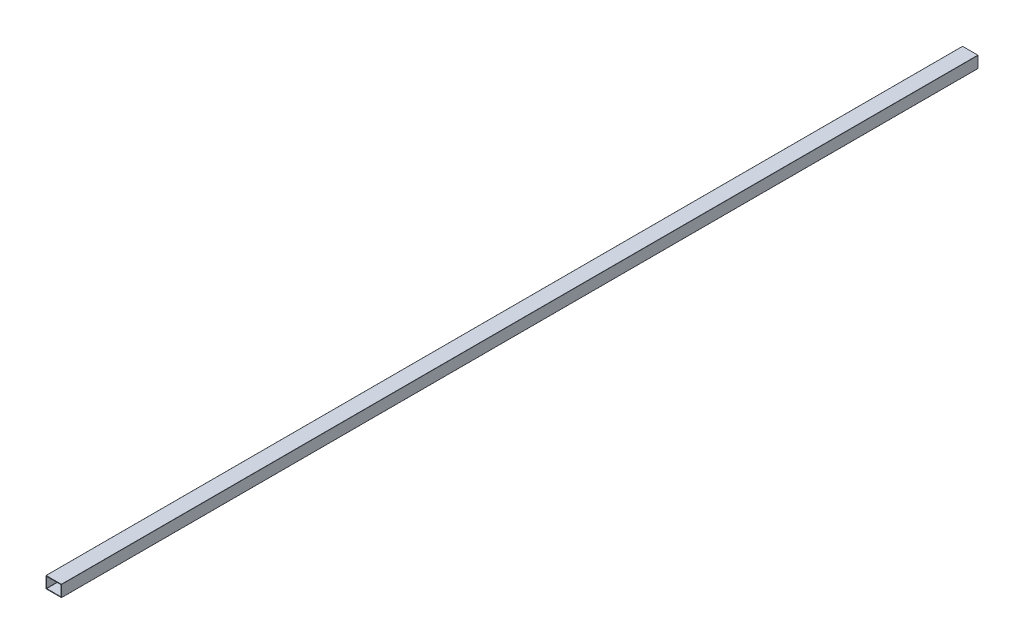
ISO-10303-21;
HEADER;
FILE_DESCRIPTION(('STEP AP214'),'2;1');
FILE_NAME('part.step','',(''),(''),'','','');
FILE_SCHEMA(('AUTOMOTIVE_DESIGN { 1 0 10303 214 1 1 1 1 }'));
ENDSEC;
DATA;
#1=APPLICATION_CONTEXT('core data for automotive mechanical design processes');
#2=APPLICATION_PROTOCOL_DEFINITION('international standard','automotive_design',2000,#1);
#3=PRODUCT_CONTEXT('',#1,'mechanical');
#4=PRODUCT('Part','Part','',(#3));
#5=PRODUCT_RELATED_PRODUCT_CATEGORY('part','',(#4));
#6=PRODUCT_DEFINITION_FORMATION('','',#4);
#7=PRODUCT_DEFINITION_CONTEXT('part definition',#1,'design');
#8=PRODUCT_DEFINITION('design','',#6,#7);
#9=PRODUCT_DEFINITION_SHAPE('','',#8);
#10=(LENGTH_UNIT() NAMED_UNIT(*) SI_UNIT(.MILLI.,.METRE.));
#11=(NAMED_UNIT(*) PLANE_ANGLE_UNIT() SI_UNIT($,.RADIAN.));
#12=(NAMED_UNIT(*) SI_UNIT($,.STERADIAN.) SOLID_ANGLE_UNIT());
#13=UNCERTAINTY_MEASURE_WITH_UNIT(LENGTH_MEASURE(1.E-05),#10,'distance_accuracy_value','');
#14=(GEOMETRIC_REPRESENTATION_CONTEXT(3) GLOBAL_UNCERTAINTY_ASSIGNED_CONTEXT((#13)) GLOBAL_UNIT_ASSIGNED_CONTEXT((#10,
#11,#12)) REPRESENTATION_CONTEXT('',''));
#15=CARTESIAN_POINT('',(0.,0.,0.));
#16=DIRECTION('',(0.,0.,1.));
#17=DIRECTION('',(1.,0.,0.));
#18=AXIS2_PLACEMENT_3D('',#15,#16,#17);
#19=CARTESIAN_POINT('',(50.8,-38.1,-6000.));
#20=DIRECTION('',(1.,0.,0.));
#21=DIRECTION('',(0.,0.,-1.));
#22=AXIS2_PLACEMENT_3D('',#19,#20,#21);
#23=PLANE('',#22);
#24=DIRECTION('',(0.,1.,0.));
#25=VECTOR('',#24,1.);
#26=CARTESIAN_POINT('',(50.8,-38.1,0.));
#27=LINE('',#26,#25);
#28=CARTESIAN_POINT('',(50.8,-37.1,0.));
#29=VERTEX_POINT('',#28);
#30=CARTESIAN_POINT('',(50.8,37.1,0.));
#31=VERTEX_POINT('',#30);
#32=EDGE_CURVE('E197',#29,#31,#27,.T.);
#33=ORIENTED_EDGE('',*,*,#32,.F.);
#34=DIRECTION('',(0.,0.,1.));
#35=VECTOR('',#34,1.);
#36=CARTESIAN_POINT('',(50.8,-37.1,-6000.));
#37=LINE('',#36,#35);
#38=CARTESIAN_POINT('',(50.8,-37.1,-6000.));
#39=VERTEX_POINT('',#38);
#40=EDGE_CURVE('E158',#29,#39,#37,.F.);
#41=ORIENTED_EDGE('',*,*,#40,.T.);
#42=DIRECTION('',(0.,1.,0.));
#43=VECTOR('',#42,1.);
#44=CARTESIAN_POINT('',(50.8,-38.1,-6000.));
#45=LINE('',#44,#43);
#46=CARTESIAN_POINT('',(50.8,37.1,-6000.));
#47=VERTEX_POINT('',#46);
#48=EDGE_CURVE('E185',#39,#47,#45,.T.);
#49=ORIENTED_EDGE('',*,*,#48,.T.);
#50=DIRECTION('',(0.,0.,1.));
#51=VECTOR('',#50,1.);
#52=CARTESIAN_POINT('',(50.8,37.1,-6000.));
#53=LINE('',#52,#51);
#54=EDGE_CURVE('E251',#47,#31,#53,.T.);
#55=ORIENTED_EDGE('',*,*,#54,.T.);
#56=EDGE_LOOP('',(#33,#41,#49,#55));
#57=FACE_BOUND('',#56,.T.);
#58=ADVANCED_FACE('F33',(#57),#23,.T.);
#59=CARTESIAN_POINT('',(-50.8,-38.1,-6000.));
#60=DIRECTION('',(0.,-1.,0.));
#61=DIRECTION('',(0.,0.,-1.));
#62=AXIS2_PLACEMENT_3D('',#59,#60,#61);
#63=PLANE('',#62);
#64=DIRECTION('',(1.,0.,0.));
#65=VECTOR('',#64,1.);
#66=CARTESIAN_POINT('',(-50.8,-38.1,0.));
#67=LINE('',#66,#65);
#68=CARTESIAN_POINT('',(-49.8,-38.1,0.));
#69=VERTEX_POINT('',#68);
#70=CARTESIAN_POINT('',(49.8,-38.1,0.));
#71=VERTEX_POINT('',#70);
#72=EDGE_CURVE('E189',#69,#71,#67,.T.);
#73=ORIENTED_EDGE('',*,*,#72,.F.);
#74=DIRECTION('',(0.,0.,1.));
#75=VECTOR('',#74,1.);
#76=CARTESIAN_POINT('',(-49.8,-38.1,-6000.));
#77=LINE('',#76,#75);
#78=CARTESIAN_POINT('',(-49.8,-38.1,-6000.));
#79=VERTEX_POINT('',#78);
#80=EDGE_CURVE('E238',#69,#79,#77,.F.);
#81=ORIENTED_EDGE('',*,*,#80,.T.);
#82=DIRECTION('',(1.,0.,0.));
#83=VECTOR('',#82,1.);
#84=CARTESIAN_POINT('',(-50.8,-38.1,-6000.));
#85=LINE('',#84,#83);
#86=CARTESIAN_POINT('',(49.8,-38.1,-6000.));
#87=VERTEX_POINT('',#86);
#88=EDGE_CURVE('E194',#79,#87,#85,.T.);
#89=ORIENTED_EDGE('',*,*,#88,.T.);
#90=DIRECTION('',(0.,0.,1.));
#91=VECTOR('',#90,1.);
#92=CARTESIAN_POINT('',(49.8,-38.1,-6000.));
#93=LINE('',#92,#91);
#94=EDGE_CURVE('E235',#87,#71,#93,.T.);
#95=ORIENTED_EDGE('',*,*,#94,.T.);
#96=EDGE_LOOP('',(#73,#81,#89,#95));
#97=FACE_BOUND('',#96,.T.);
#98=ADVANCED_FACE('F305',(#97),#63,.T.);
#99=CARTESIAN_POINT('',(-50.8,-38.1,-6000.));
#100=DIRECTION('',(-1.,0.,0.));
#101=DIRECTION('',(0.,0.,1.));
#102=AXIS2_PLACEMENT_3D('',#99,#100,#101);
#103=PLANE('',#102);
#104=DIRECTION('',(0.,-1.,0.));
#105=VECTOR('',#104,1.);
#106=CARTESIAN_POINT('',(-50.8,-38.1,-6000.));
#107=LINE('',#106,#105);
#108=CARTESIAN_POINT('',(-50.8,37.1,-6000.));
#109=VERTEX_POINT('',#108);
#110=CARTESIAN_POINT('',(-50.8,-37.1,-6000.));
#111=VERTEX_POINT('',#110);
#112=EDGE_CURVE('E191',#109,#111,#107,.T.);
#113=ORIENTED_EDGE('',*,*,#112,.T.);
#114=DIRECTION('',(0.,0.,1.));
#115=VECTOR('',#114,1.);
#116=CARTESIAN_POINT('',(-50.8,-37.1,-6000.));
#117=LINE('',#116,#115);
#118=CARTESIAN_POINT('',(-50.8,-37.1,0.));
#119=VERTEX_POINT('',#118);
#120=EDGE_CURVE('E224',#111,#119,#117,.T.);
#121=ORIENTED_EDGE('',*,*,#120,.T.);
#122=DIRECTION('',(0.,-1.,0.));
#123=VECTOR('',#122,1.);
#124=CARTESIAN_POINT('',(-50.8,-38.1,0.));
#125=LINE('',#124,#123);
#126=CARTESIAN_POINT('',(-50.8,37.1,0.));
#127=VERTEX_POINT('',#126);
#128=EDGE_CURVE('E203',#127,#119,#125,.T.);
#129=ORIENTED_EDGE('',*,*,#128,.F.);
#130=DIRECTION('',(0.,0.,1.));
#131=VECTOR('',#130,1.);
#132=CARTESIAN_POINT('',(-50.8,37.1,-6000.));
#133=LINE('',#132,#131);
#134=EDGE_CURVE('E222',#127,#109,#133,.F.);
#135=ORIENTED_EDGE('',*,*,#134,.T.);
#136=EDGE_LOOP('',(#113,#121,#129,#135));
#137=FACE_BOUND('',#136,.T.);
#138=ADVANCED_FACE('F311',(#137),#103,.T.);
#139=CARTESIAN_POINT('',(-50.8,38.1,-6000.));
#140=DIRECTION('',(0.,1.,0.));
#141=DIRECTION('',(0.,0.,1.));
#142=AXIS2_PLACEMENT_3D('',#139,#140,#141);
#143=PLANE('',#142);
#144=DIRECTION('',(-1.,0.,0.));
#145=VECTOR('',#144,1.);
#146=CARTESIAN_POINT('',(-50.8,38.1,-6000.));
#147=LINE('',#146,#145);
#148=CARTESIAN_POINT('',(49.8,38.1,-6000.));
#149=VERTEX_POINT('',#148);
#150=CARTESIAN_POINT('',(-49.8,38.1,-6000.));
#151=VERTEX_POINT('',#150);
#152=EDGE_CURVE('E188',#149,#151,#147,.T.);
#153=ORIENTED_EDGE('',*,*,#152,.T.);
#154=DIRECTION('',(0.,0.,1.));
#155=VECTOR('',#154,1.);
#156=CARTESIAN_POINT('',(-49.8,38.1,-6000.));
#157=LINE('',#156,#155);
#158=CARTESIAN_POINT('',(-49.8,38.1,0.));
#159=VERTEX_POINT('',#158);
#160=EDGE_CURVE('E248',#151,#159,#157,.T.);
#161=ORIENTED_EDGE('',*,*,#160,.T.);
#162=DIRECTION('',(-1.,0.,0.));
#163=VECTOR('',#162,1.);
#164=CARTESIAN_POINT('',(-50.8,38.1,0.));
#165=LINE('',#164,#163);
#166=CARTESIAN_POINT('',(49.8,38.1,0.));
#167=VERTEX_POINT('',#166);
#168=EDGE_CURVE('E200',#167,#159,#165,.T.);
#169=ORIENTED_EDGE('',*,*,#168,.F.);
#170=DIRECTION('',(0.,0.,1.));
#171=VECTOR('',#170,1.);
#172=CARTESIAN_POINT('',(49.8,38.1,-6000.));
#173=LINE('',#172,#171);
#174=EDGE_CURVE('E55',#167,#149,#173,.F.);
#175=ORIENTED_EDGE('',*,*,#174,.T.);
#176=EDGE_LOOP('',(#153,#161,#169,#175));
#177=FACE_BOUND('',#176,.T.);
#178=ADVANCED_FACE('F316',(#177),#143,.T.);
#179=CARTESIAN_POINT('',(0.,0.,-6000.));
#180=DIRECTION('',(0.,0.,-1.));
#181=DIRECTION('',(-1.,0.,0.));
#182=AXIS2_PLACEMENT_3D('',#179,#180,#181);
#183=PLANE('',#182);
#184=DIRECTION('',(0.,-1.,0.));
#185=VECTOR('',#184,1.);
#186=CARTESIAN_POINT('',(-47.,-34.3,-6000.));
#187=LINE('',#186,#185);
#188=CARTESIAN_POINT('',(-47.,33.3,-6000.));
#189=VERTEX_POINT('',#188);
#190=CARTESIAN_POINT('',(-47.,-33.3,-6000.));
#191=VERTEX_POINT('',#190);
#192=EDGE_CURVE('E167',#189,#191,#187,.T.);
#193=ORIENTED_EDGE('',*,*,#192,.T.);
#194=CARTESIAN_POINT('',(-46.,-33.3,-6000.));
#195=DIRECTION('',(0.,0.,-1.));
#196=DIRECTION('',(-1.,0.,0.));
#197=AXIS2_PLACEMENT_3D('',#194,#195,#196);
#198=CIRCLE('',#197,1.);
#199=CARTESIAN_POINT('',(-46.,-34.3,-6000.));
#200=VERTEX_POINT('',#199);
#201=EDGE_CURVE('E11',#191,#200,#198,.F.);
#202=ORIENTED_EDGE('',*,*,#201,.T.);
#203=DIRECTION('',(1.,0.,0.));
#204=VECTOR('',#203,1.);
#205=CARTESIAN_POINT('',(-47.,-34.3,-6000.));
#206=LINE('',#205,#204);
#207=CARTESIAN_POINT('',(46.,-34.3,-6000.));
#208=VERTEX_POINT('',#207);
#209=EDGE_CURVE('E175',#200,#208,#206,.T.);
#210=ORIENTED_EDGE('',*,*,#209,.T.);
#211=CARTESIAN_POINT('',(46.,-33.3,-6000.));
#212=DIRECTION('',(0.,0.,-1.));
#213=DIRECTION('',(-1.,0.,0.));
#214=AXIS2_PLACEMENT_3D('',#211,#212,#213);
#215=CIRCLE('',#214,1.);
#216=CARTESIAN_POINT('',(47.,-33.3,-6000.));
#217=VERTEX_POINT('',#216);
#218=EDGE_CURVE('E262',#208,#217,#215,.F.);
#219=ORIENTED_EDGE('',*,*,#218,.T.);
#220=DIRECTION('',(0.,1.,0.));
#221=VECTOR('',#220,1.);
#222=CARTESIAN_POINT('',(47.,-34.3,-6000.));
#223=LINE('',#222,#221);
#224=CARTESIAN_POINT('',(47.,33.3,-6000.));
#225=VERTEX_POINT('',#224);
#226=EDGE_CURVE('E179',#217,#225,#223,.T.);
#227=ORIENTED_EDGE('',*,*,#226,.T.);
#228=CARTESIAN_POINT('',(46.,33.3,-6000.));
#229=DIRECTION('',(0.,0.,-1.));
#230=DIRECTION('',(-1.,0.,0.));
#231=AXIS2_PLACEMENT_3D('',#228,#229,#230);
#232=CIRCLE('',#231,1.);
#233=CARTESIAN_POINT('',(46.,34.3,-6000.));
#234=VERTEX_POINT('',#233);
#235=EDGE_CURVE('E258',#225,#234,#232,.F.);
#236=ORIENTED_EDGE('',*,*,#235,.T.);
#237=DIRECTION('',(-1.,0.,0.));
#238=VECTOR('',#237,1.);
#239=CARTESIAN_POINT('',(-47.,34.3,-6000.));
#240=LINE('',#239,#238);
#241=CARTESIAN_POINT('',(-46.,34.3,-6000.));
#242=VERTEX_POINT('',#241);
#243=EDGE_CURVE('E277',#234,#242,#240,.T.);
#244=ORIENTED_EDGE('',*,*,#243,.T.);
#245=CARTESIAN_POINT('',(-46.,33.3,-6000.));
#246=DIRECTION('',(0.,0.,-1.));
#247=DIRECTION('',(-1.,0.,0.));
#248=AXIS2_PLACEMENT_3D('',#245,#246,#247);
#249=CIRCLE('',#248,1.);
#250=EDGE_CURVE('E157',#242,#189,#249,.F.);
#251=ORIENTED_EDGE('',*,*,#250,.T.);
#252=EDGE_LOOP('',(#193,#202,#210,#219,#227,#236,#244,#251));
#253=FACE_BOUND('',#252,.T.);
#254=ORIENTED_EDGE('',*,*,#88,.F.);
#255=CARTESIAN_POINT('',(-49.8,-37.1,-6000.));
#256=DIRECTION('',(0.,0.,-1.));
#257=DIRECTION('',(-1.,0.,0.));
#258=AXIS2_PLACEMENT_3D('',#255,#256,#257);
#259=CIRCLE('',#258,1.);
#260=EDGE_CURVE('E245',#79,#111,#259,.T.);
#261=ORIENTED_EDGE('',*,*,#260,.T.);
#262=ORIENTED_EDGE('',*,*,#112,.F.);
#263=CARTESIAN_POINT('',(-49.8,37.1,-6000.));
#264=DIRECTION('',(0.,0.,-1.));
#265=DIRECTION('',(-1.,0.,0.));
#266=AXIS2_PLACEMENT_3D('',#263,#264,#265);
#267=CIRCLE('',#266,1.);
#268=EDGE_CURVE('E48',#109,#151,#267,.T.);
#269=ORIENTED_EDGE('',*,*,#268,.T.);
#270=ORIENTED_EDGE('',*,*,#152,.F.);
#271=CARTESIAN_POINT('',(49.8,37.1,-6000.));
#272=DIRECTION('',(0.,0.,-1.));
#273=DIRECTION('',(-1.,0.,0.));
#274=AXIS2_PLACEMENT_3D('',#271,#272,#273);
#275=CIRCLE('',#274,1.);
#276=EDGE_CURVE('E240',#149,#47,#275,.T.);
#277=ORIENTED_EDGE('',*,*,#276,.T.);
#278=ORIENTED_EDGE('',*,*,#48,.F.);
#279=CARTESIAN_POINT('',(49.8,-37.1,-6000.));
#280=DIRECTION('',(0.,0.,-1.));
#281=DIRECTION('',(-1.,0.,0.));
#282=AXIS2_PLACEMENT_3D('',#279,#280,#281);
#283=CIRCLE('',#282,1.);
#284=EDGE_CURVE('E242',#39,#87,#283,.T.);
#285=ORIENTED_EDGE('',*,*,#284,.T.);
#286=EDGE_LOOP('',(#254,#261,#262,#269,#270,#277,#278,#285));
#287=FACE_BOUND('',#286,.T.);
#288=ADVANCED_FACE('F267',(#253,#287),#183,.T.);
#289=CARTESIAN_POINT('',(0.,0.,0.));
#290=DIRECTION('',(0.,0.,-1.));
#291=DIRECTION('',(-1.,0.,0.));
#292=AXIS2_PLACEMENT_3D('',#289,#290,#291);
#293=PLANE('',#292);
#294=DIRECTION('',(0.,1.,0.));
#295=VECTOR('',#294,1.);
#296=CARTESIAN_POINT('',(47.,-34.3,0.));
#297=LINE('',#296,#295);
#298=CARTESIAN_POINT('',(47.,-33.3,0.));
#299=VERTEX_POINT('',#298);
#300=CARTESIAN_POINT('',(47.,33.3,0.));
#301=VERTEX_POINT('',#300);
#302=EDGE_CURVE('E181',#299,#301,#297,.T.);
#303=ORIENTED_EDGE('',*,*,#302,.F.);
#304=CARTESIAN_POINT('',(46.,-33.3,0.));
#305=DIRECTION('',(0.,0.,-1.));
#306=DIRECTION('',(-1.,0.,0.));
#307=AXIS2_PLACEMENT_3D('',#304,#305,#306);
#308=CIRCLE('',#307,1.);
#309=CARTESIAN_POINT('',(46.,-34.3,0.));
#310=VERTEX_POINT('',#309);
#311=EDGE_CURVE('E260',#299,#310,#308,.T.);
#312=ORIENTED_EDGE('',*,*,#311,.T.);
#313=DIRECTION('',(1.,0.,0.));
#314=VECTOR('',#313,1.);
#315=CARTESIAN_POINT('',(-47.,-34.3,0.));
#316=LINE('',#315,#314);
#317=CARTESIAN_POINT('',(-46.,-34.3,0.));
#318=VERTEX_POINT('',#317);
#319=EDGE_CURVE('E281',#318,#310,#316,.T.);
#320=ORIENTED_EDGE('',*,*,#319,.F.);
#321=CARTESIAN_POINT('',(-46.,-33.3,0.));
#322=DIRECTION('',(0.,0.,-1.));
#323=DIRECTION('',(-1.,0.,0.));
#324=AXIS2_PLACEMENT_3D('',#321,#322,#323);
#325=CIRCLE('',#324,1.);
#326=CARTESIAN_POINT('',(-47.,-33.3,0.));
#327=VERTEX_POINT('',#326);
#328=EDGE_CURVE('E41',#318,#327,#325,.T.);
#329=ORIENTED_EDGE('',*,*,#328,.T.);
#330=DIRECTION('',(0.,-1.,0.));
#331=VECTOR('',#330,1.);
#332=CARTESIAN_POINT('',(-47.,-34.3,0.));
#333=LINE('',#332,#331);
#334=CARTESIAN_POINT('',(-47.,33.3,0.));
#335=VERTEX_POINT('',#334);
#336=EDGE_CURVE('E164',#335,#327,#333,.T.);
#337=ORIENTED_EDGE('',*,*,#336,.F.);
#338=CARTESIAN_POINT('',(-46.,33.3,0.));
#339=DIRECTION('',(0.,0.,-1.));
#340=DIRECTION('',(-1.,0.,0.));
#341=AXIS2_PLACEMENT_3D('',#338,#339,#340);
#342=CIRCLE('',#341,1.);
#343=CARTESIAN_POINT('',(-46.,34.3,0.));
#344=VERTEX_POINT('',#343);
#345=EDGE_CURVE('E147',#335,#344,#342,.T.);
#346=ORIENTED_EDGE('',*,*,#345,.T.);
#347=DIRECTION('',(-1.,0.,0.));
#348=VECTOR('',#347,1.);
#349=CARTESIAN_POINT('',(-47.,34.3,0.));
#350=LINE('',#349,#348);
#351=CARTESIAN_POINT('',(46.,34.3,0.));
#352=VERTEX_POINT('',#351);
#353=EDGE_CURVE('E176',#352,#344,#350,.T.);
#354=ORIENTED_EDGE('',*,*,#353,.F.);
#355=CARTESIAN_POINT('',(46.,33.3,0.));
#356=DIRECTION('',(0.,0.,-1.));
#357=DIRECTION('',(-1.,0.,0.));
#358=AXIS2_PLACEMENT_3D('',#355,#356,#357);
#359=CIRCLE('',#358,1.);
#360=EDGE_CURVE('E256',#352,#301,#359,.T.);
#361=ORIENTED_EDGE('',*,*,#360,.T.);
#362=EDGE_LOOP('',(#303,#312,#320,#329,#337,#346,#354,#361));
#363=FACE_BOUND('',#362,.T.);
#364=ORIENTED_EDGE('',*,*,#128,.T.);
#365=CARTESIAN_POINT('',(-49.8,-37.1,0.));
#366=DIRECTION('',(0.,0.,-1.));
#367=DIRECTION('',(-1.,0.,0.));
#368=AXIS2_PLACEMENT_3D('',#365,#366,#367);
#369=CIRCLE('',#368,1.);
#370=EDGE_CURVE('E233',#119,#69,#369,.F.);
#371=ORIENTED_EDGE('',*,*,#370,.T.);
#372=ORIENTED_EDGE('',*,*,#72,.T.);
#373=CARTESIAN_POINT('',(49.8,-37.1,0.));
#374=DIRECTION('',(0.,0.,-1.));
#375=DIRECTION('',(-1.,0.,0.));
#376=AXIS2_PLACEMENT_3D('',#373,#374,#375);
#377=CIRCLE('',#376,1.);
#378=EDGE_CURVE('E229',#71,#29,#377,.F.);
#379=ORIENTED_EDGE('',*,*,#378,.T.);
#380=ORIENTED_EDGE('',*,*,#32,.T.);
#381=CARTESIAN_POINT('',(49.8,37.1,0.));
#382=DIRECTION('',(0.,0.,-1.));
#383=DIRECTION('',(-1.,0.,0.));
#384=AXIS2_PLACEMENT_3D('',#381,#382,#383);
#385=CIRCLE('',#384,1.);
#386=EDGE_CURVE('E227',#31,#167,#385,.F.);
#387=ORIENTED_EDGE('',*,*,#386,.T.);
#388=ORIENTED_EDGE('',*,*,#168,.T.);
#389=CARTESIAN_POINT('',(-49.8,37.1,0.));
#390=DIRECTION('',(0.,0.,-1.));
#391=DIRECTION('',(-1.,0.,0.));
#392=AXIS2_PLACEMENT_3D('',#389,#390,#391);
#393=CIRCLE('',#392,1.);
#394=EDGE_CURVE('E231',#159,#127,#393,.F.);
#395=ORIENTED_EDGE('',*,*,#394,.T.);
#396=EDGE_LOOP('',(#364,#371,#372,#379,#380,#387,#388,#395));
#397=FACE_BOUND('',#396,.T.);
#398=ADVANCED_FACE('F172',(#363,#397),#293,.F.);
#399=CARTESIAN_POINT('',(-47.,-34.3,-6000.));
#400=DIRECTION('',(0.,-1.,0.));
#401=DIRECTION('',(0.,0.,-1.));
#402=AXIS2_PLACEMENT_3D('',#399,#400,#401);
#403=PLANE('',#402);
#404=ORIENTED_EDGE('',*,*,#319,.T.);
#405=DIRECTION('',(0.,0.,1.));
#406=VECTOR('',#405,1.);
#407=CARTESIAN_POINT('',(46.,-34.3,-6000.));
#408=LINE('',#407,#406);
#409=EDGE_CURVE('E220',#310,#208,#408,.F.);
#410=ORIENTED_EDGE('',*,*,#409,.T.);
#411=ORIENTED_EDGE('',*,*,#209,.F.);
#412=DIRECTION('',(0.,0.,1.));
#413=VECTOR('',#412,1.);
#414=CARTESIAN_POINT('',(-46.,-34.3,0.));
#415=LINE('',#414,#413);
#416=EDGE_CURVE('E217',#200,#318,#415,.T.);
#417=ORIENTED_EDGE('',*,*,#416,.T.);
#418=EDGE_LOOP('',(#404,#410,#411,#417));
#419=FACE_BOUND('',#418,.T.);
#420=ADVANCED_FACE('F283',(#419),#403,.F.);
#421=CARTESIAN_POINT('',(-47.,-34.3,-6000.));
#422=DIRECTION('',(-1.,0.,0.));
#423=DIRECTION('',(0.,0.,1.));
#424=AXIS2_PLACEMENT_3D('',#421,#422,#423);
#425=PLANE('',#424);
#426=ORIENTED_EDGE('',*,*,#192,.F.);
#427=DIRECTION('',(0.,0.,1.));
#428=VECTOR('',#427,1.);
#429=CARTESIAN_POINT('',(-47.,33.3,0.));
#430=LINE('',#429,#428);
#431=EDGE_CURVE('E151',#189,#335,#430,.T.);
#432=ORIENTED_EDGE('',*,*,#431,.T.);
#433=ORIENTED_EDGE('',*,*,#336,.T.);
#434=DIRECTION('',(0.,0.,1.));
#435=VECTOR('',#434,1.);
#436=CARTESIAN_POINT('',(-47.,-33.3,-6000.));
#437=LINE('',#436,#435);
#438=EDGE_CURVE('E169',#327,#191,#437,.F.);
#439=ORIENTED_EDGE('',*,*,#438,.T.);
#440=EDGE_LOOP('',(#426,#432,#433,#439));
#441=FACE_BOUND('',#440,.T.);
#442=ADVANCED_FACE('F163',(#441),#425,.F.);
#443=CARTESIAN_POINT('',(-47.,34.3,-6000.));
#444=DIRECTION('',(0.,1.,0.));
#445=DIRECTION('',(0.,0.,1.));
#446=AXIS2_PLACEMENT_3D('',#443,#444,#445);
#447=PLANE('',#446);
#448=ORIENTED_EDGE('',*,*,#353,.T.);
#449=DIRECTION('',(0.,0.,1.));
#450=VECTOR('',#449,1.);
#451=CARTESIAN_POINT('',(-46.,34.3,-6000.));
#452=LINE('',#451,#450);
#453=EDGE_CURVE('E152',#344,#242,#452,.F.);
#454=ORIENTED_EDGE('',*,*,#453,.T.);
#455=ORIENTED_EDGE('',*,*,#243,.F.);
#456=DIRECTION('',(0.,0.,1.));
#457=VECTOR('',#456,1.);
#458=CARTESIAN_POINT('',(46.,34.3,0.));
#459=LINE('',#458,#457);
#460=EDGE_CURVE('E168',#234,#352,#459,.T.);
#461=ORIENTED_EDGE('',*,*,#460,.T.);
#462=EDGE_LOOP('',(#448,#454,#455,#461));
#463=FACE_BOUND('',#462,.T.);
#464=ADVANCED_FACE('F292',(#463),#447,.F.);
#465=CARTESIAN_POINT('',(47.,-34.3,-6000.));
#466=DIRECTION('',(1.,0.,0.));
#467=DIRECTION('',(0.,0.,-1.));
#468=AXIS2_PLACEMENT_3D('',#465,#466,#467);
#469=PLANE('',#468);
#470=ORIENTED_EDGE('',*,*,#302,.T.);
#471=DIRECTION('',(0.,0.,1.));
#472=VECTOR('',#471,1.);
#473=CARTESIAN_POINT('',(47.,33.3,-6000.));
#474=LINE('',#473,#472);
#475=EDGE_CURVE('E215',#301,#225,#474,.F.);
#476=ORIENTED_EDGE('',*,*,#475,.T.);
#477=ORIENTED_EDGE('',*,*,#226,.F.);
#478=DIRECTION('',(0.,0.,1.));
#479=VECTOR('',#478,1.);
#480=CARTESIAN_POINT('',(47.,-33.3,0.));
#481=LINE('',#480,#479);
#482=EDGE_CURVE('E212',#217,#299,#481,.T.);
#483=ORIENTED_EDGE('',*,*,#482,.T.);
#484=EDGE_LOOP('',(#470,#476,#477,#483));
#485=FACE_BOUND('',#484,.T.);
#486=ADVANCED_FACE('F275',(#485),#469,.F.);
#487=CARTESIAN_POINT('',(-46.,33.3,-6000.));
#488=DIRECTION('',(0.,0.,-1.));
#489=DIRECTION('',(-1.,0.,0.));
#490=AXIS2_PLACEMENT_3D('',#487,#488,#489);
#491=CYLINDRICAL_SURFACE('',#490,1.);
#492=ORIENTED_EDGE('',*,*,#250,.F.);
#493=ORIENTED_EDGE('',*,*,#453,.F.);
#494=ORIENTED_EDGE('',*,*,#345,.F.);
#495=ORIENTED_EDGE('',*,*,#431,.F.);
#496=EDGE_LOOP('',(#492,#493,#494,#495));
#497=FACE_BOUND('',#496,.T.);
#498=ADVANCED_FACE('F150',(#497),#491,.F.);
#499=CARTESIAN_POINT('',(46.,33.3,-6000.));
#500=DIRECTION('',(0.,0.,-1.));
#501=DIRECTION('',(-1.,0.,0.));
#502=AXIS2_PLACEMENT_3D('',#499,#500,#501);
#503=CYLINDRICAL_SURFACE('',#502,1.);
#504=ORIENTED_EDGE('',*,*,#235,.F.);
#505=ORIENTED_EDGE('',*,*,#475,.F.);
#506=ORIENTED_EDGE('',*,*,#360,.F.);
#507=ORIENTED_EDGE('',*,*,#460,.F.);
#508=EDGE_LOOP('',(#504,#505,#506,#507));
#509=FACE_BOUND('',#508,.T.);
#510=ADVANCED_FACE('F294',(#509),#503,.F.);
#511=CARTESIAN_POINT('',(46.,-33.3,-6000.));
#512=DIRECTION('',(0.,0.,-1.));
#513=DIRECTION('',(-1.,0.,0.));
#514=AXIS2_PLACEMENT_3D('',#511,#512,#513);
#515=CYLINDRICAL_SURFACE('',#514,1.);
#516=ORIENTED_EDGE('',*,*,#218,.F.);
#517=ORIENTED_EDGE('',*,*,#409,.F.);
#518=ORIENTED_EDGE('',*,*,#311,.F.);
#519=ORIENTED_EDGE('',*,*,#482,.F.);
#520=EDGE_LOOP('',(#516,#517,#518,#519));
#521=FACE_BOUND('',#520,.T.);
#522=ADVANCED_FACE('F279',(#521),#515,.F.);
#523=CARTESIAN_POINT('',(-49.8,-37.1,-6000.));
#524=DIRECTION('',(0.,0.,1.));
#525=DIRECTION('',(1.,0.,0.));
#526=AXIS2_PLACEMENT_3D('',#523,#524,#525);
#527=CYLINDRICAL_SURFACE('',#526,1.);
#528=ORIENTED_EDGE('',*,*,#260,.F.);
#529=ORIENTED_EDGE('',*,*,#80,.F.);
#530=ORIENTED_EDGE('',*,*,#370,.F.);
#531=ORIENTED_EDGE('',*,*,#120,.F.);
#532=EDGE_LOOP('',(#528,#529,#530,#531));
#533=FACE_BOUND('',#532,.T.);
#534=ADVANCED_FACE('F301',(#533),#527,.T.);
#535=CARTESIAN_POINT('',(-49.8,37.1,-6000.));
#536=DIRECTION('',(0.,0.,1.));
#537=DIRECTION('',(1.,0.,0.));
#538=AXIS2_PLACEMENT_3D('',#535,#536,#537);
#539=CYLINDRICAL_SURFACE('',#538,1.);
#540=ORIENTED_EDGE('',*,*,#268,.F.);
#541=ORIENTED_EDGE('',*,*,#134,.F.);
#542=ORIENTED_EDGE('',*,*,#394,.F.);
#543=ORIENTED_EDGE('',*,*,#160,.F.);
#544=EDGE_LOOP('',(#540,#541,#542,#543));
#545=FACE_BOUND('',#544,.T.);
#546=ADVANCED_FACE('F368',(#545),#539,.T.);
#547=CARTESIAN_POINT('',(-46.,-33.3,-6000.));
#548=DIRECTION('',(0.,0.,-1.));
#549=DIRECTION('',(-1.,0.,0.));
#550=AXIS2_PLACEMENT_3D('',#547,#548,#549);
#551=CYLINDRICAL_SURFACE('',#550,1.);
#552=ORIENTED_EDGE('',*,*,#201,.F.);
#553=ORIENTED_EDGE('',*,*,#438,.F.);
#554=ORIENTED_EDGE('',*,*,#328,.F.);
#555=ORIENTED_EDGE('',*,*,#416,.F.);
#556=EDGE_LOOP('',(#552,#553,#554,#555));
#557=FACE_BOUND('',#556,.T.);
#558=ADVANCED_FACE('F378',(#557),#551,.F.);
#559=CARTESIAN_POINT('',(49.8,-37.1,-6000.));
#560=DIRECTION('',(0.,0.,1.));
#561=DIRECTION('',(1.,0.,0.));
#562=AXIS2_PLACEMENT_3D('',#559,#560,#561);
#563=CYLINDRICAL_SURFACE('',#562,1.);
#564=ORIENTED_EDGE('',*,*,#284,.F.);
#565=ORIENTED_EDGE('',*,*,#40,.F.);
#566=ORIENTED_EDGE('',*,*,#378,.F.);
#567=ORIENTED_EDGE('',*,*,#94,.F.);
#568=EDGE_LOOP('',(#564,#565,#566,#567));
#569=FACE_BOUND('',#568,.T.);
#570=ADVANCED_FACE('F388',(#569),#563,.T.);
#571=CARTESIAN_POINT('',(49.8,37.1,-6000.));
#572=DIRECTION('',(0.,0.,1.));
#573=DIRECTION('',(1.,0.,0.));
#574=AXIS2_PLACEMENT_3D('',#571,#572,#573);
#575=CYLINDRICAL_SURFACE('',#574,1.);
#576=ORIENTED_EDGE('',*,*,#276,.F.);
#577=ORIENTED_EDGE('',*,*,#174,.F.);
#578=ORIENTED_EDGE('',*,*,#386,.F.);
#579=ORIENTED_EDGE('',*,*,#54,.F.);
#580=EDGE_LOOP('',(#576,#577,#578,#579));
#581=FACE_BOUND('',#580,.T.);
#582=ADVANCED_FACE('F35',(#581),#575,.T.);
#583=CLOSED_SHELL('',(#58,#98,#138,#178,#288,#398,#420,#442,#464,#486,#498,#510,#522,#534,#546,
#558,#570,#582));
#584=MANIFOLD_SOLID_BREP('B2',#583);
#585=ADVANCED_BREP_SHAPE_REPRESENTATION('',(#18,#584),#14);
#586=SHAPE_DEFINITION_REPRESENTATION(#9,#585);
ENDSEC;
END-ISO-10303-21;
